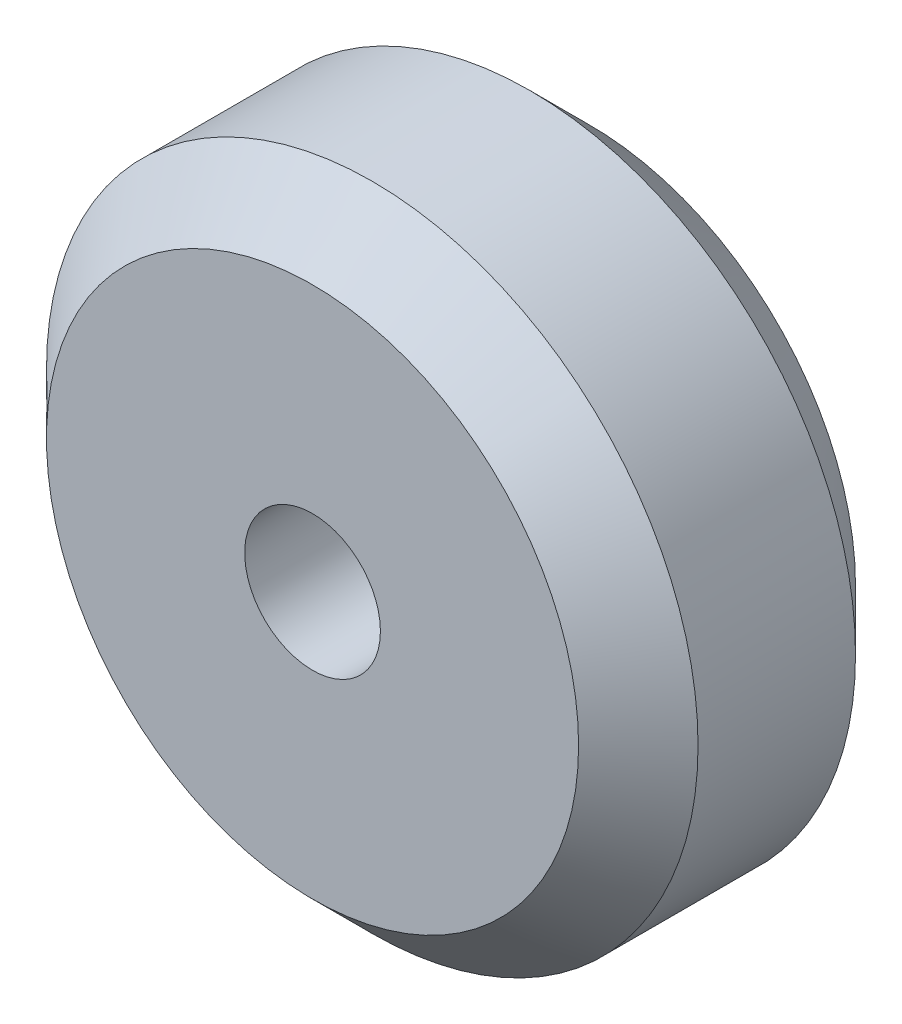
ISO-10303-21;
HEADER;
FILE_DESCRIPTION(('STEP AP214'),'2;1');
FILE_NAME('part.step','',(''),(''),'','','');
FILE_SCHEMA(('AUTOMOTIVE_DESIGN { 1 0 10303 214 1 1 1 1 }'));
ENDSEC;
DATA;
#1=APPLICATION_CONTEXT('core data for automotive mechanical design processes');
#2=APPLICATION_PROTOCOL_DEFINITION('international standard','automotive_design',2000,#1);
#3=PRODUCT_CONTEXT('',#1,'mechanical');
#4=PRODUCT('Part','Part','',(#3));
#5=PRODUCT_RELATED_PRODUCT_CATEGORY('part','',(#4));
#6=PRODUCT_DEFINITION_FORMATION('','',#4);
#7=PRODUCT_DEFINITION_CONTEXT('part definition',#1,'design');
#8=PRODUCT_DEFINITION('design','',#6,#7);
#9=PRODUCT_DEFINITION_SHAPE('','',#8);
#10=(LENGTH_UNIT() NAMED_UNIT(*) SI_UNIT(.MILLI.,.METRE.));
#11=(NAMED_UNIT(*) PLANE_ANGLE_UNIT() SI_UNIT($,.RADIAN.));
#12=(NAMED_UNIT(*) SI_UNIT($,.STERADIAN.) SOLID_ANGLE_UNIT());
#13=UNCERTAINTY_MEASURE_WITH_UNIT(LENGTH_MEASURE(1.E-05),#10,'distance_accuracy_value','');
#14=(GEOMETRIC_REPRESENTATION_CONTEXT(3) GLOBAL_UNCERTAINTY_ASSIGNED_CONTEXT((#13)) GLOBAL_UNIT_ASSIGNED_CONTEXT((#10,
#11,#12)) REPRESENTATION_CONTEXT('',''));
#15=CARTESIAN_POINT('',(0.,0.,0.));
#16=DIRECTION('',(0.,0.,1.));
#17=DIRECTION('',(1.,0.,0.));
#18=AXIS2_PLACEMENT_3D('',#15,#16,#17);
#19=CARTESIAN_POINT('',(19.85,-19.85,10.2));
#20=DIRECTION('',(0.,0.,1.));
#21=DIRECTION('',(1.,0.,0.));
#22=AXIS2_PLACEMENT_3D('',#19,#20,#21);
#23=PLANE('',#22);
#24=CARTESIAN_POINT('',(19.85,-19.85,10.2));
#25=DIRECTION('',(0.,0.,1.));
#26=DIRECTION('',(1.,0.,0.));
#27=AXIS2_PLACEMENT_3D('',#24,#25,#26);
#28=CIRCLE('',#27,9.8);
#29=CARTESIAN_POINT('',(29.65,-19.85,10.2));
#30=VERTEX_POINT('',#29);
#31=EDGE_CURVE('E46',#30,#30,#28,.T.);
#32=ORIENTED_EDGE('',*,*,#31,.T.);
#33=EDGE_LOOP('',(#32));
#34=FACE_BOUND('',#33,.T.);
#35=CARTESIAN_POINT('',(19.85,-19.85,10.2));
#36=DIRECTION('',(0.,0.,1.));
#37=DIRECTION('',(1.,0.,0.));
#38=AXIS2_PLACEMENT_3D('',#35,#36,#37);
#39=CIRCLE('',#38,2.5);
#40=CARTESIAN_POINT('',(22.35,-19.85,10.2));
#41=VERTEX_POINT('',#40);
#42=EDGE_CURVE('E51',#41,#41,#39,.T.);
#43=ORIENTED_EDGE('',*,*,#42,.F.);
#44=EDGE_LOOP('',(#43));
#45=FACE_BOUND('',#44,.T.);
#46=ADVANCED_FACE('F31',(#34,#45),#23,.T.);
#47=CARTESIAN_POINT('',(19.85,-19.85,0.));
#48=DIRECTION('',(0.,0.,1.));
#49=DIRECTION('',(1.,0.,0.));
#50=AXIS2_PLACEMENT_3D('',#47,#48,#49);
#51=PLANE('',#50);
#52=CARTESIAN_POINT('',(19.85,-19.85,0.));
#53=DIRECTION('',(0.,0.,1.));
#54=DIRECTION('',(1.,0.,0.));
#55=AXIS2_PLACEMENT_3D('',#52,#53,#54);
#56=CIRCLE('',#55,9.8);
#57=CARTESIAN_POINT('',(29.65,-19.85,0.));
#58=VERTEX_POINT('',#57);
#59=EDGE_CURVE('E10',#58,#58,#56,.F.);
#60=ORIENTED_EDGE('',*,*,#59,.T.);
#61=EDGE_LOOP('',(#60));
#62=FACE_BOUND('',#61,.T.);
#63=CARTESIAN_POINT('',(19.85,-19.85,0.));
#64=DIRECTION('',(0.,0.,1.));
#65=DIRECTION('',(1.,0.,0.));
#66=AXIS2_PLACEMENT_3D('',#63,#64,#65);
#67=CIRCLE('',#66,2.5);
#68=CARTESIAN_POINT('',(22.35,-19.85,0.));
#69=VERTEX_POINT('',#68);
#70=EDGE_CURVE('E52',#69,#69,#67,.T.);
#71=ORIENTED_EDGE('',*,*,#70,.T.);
#72=EDGE_LOOP('',(#71));
#73=FACE_BOUND('',#72,.T.);
#74=ADVANCED_FACE('F62',(#62,#73),#51,.F.);
#75=CARTESIAN_POINT('',(19.85,-19.85,10.2));
#76=DIRECTION('',(0.,0.,-1.));
#77=DIRECTION('',(-1.,0.,0.));
#78=AXIS2_PLACEMENT_3D('',#75,#76,#77);
#79=CYLINDRICAL_SURFACE('',#78,12.);
#80=CARTESIAN_POINT('',(19.85,-19.85,7.99999999999999));
#81=DIRECTION('',(0.,0.,1.));
#82=DIRECTION('',(1.,0.,0.));
#83=AXIS2_PLACEMENT_3D('',#80,#81,#82);
#84=CIRCLE('',#83,12.);
#85=CARTESIAN_POINT('',(31.85,-19.85,7.99999999999999));
#86=VERTEX_POINT('',#85);
#87=EDGE_CURVE('E38',#86,#86,#84,.F.);
#88=ORIENTED_EDGE('',*,*,#87,.T.);
#89=EDGE_LOOP('',(#88));
#90=FACE_BOUND('',#89,.T.);
#91=CARTESIAN_POINT('',(19.85,-19.85,2.2));
#92=DIRECTION('',(0.,0.,1.));
#93=DIRECTION('',(1.,0.,0.));
#94=AXIS2_PLACEMENT_3D('',#91,#92,#93);
#95=CIRCLE('',#94,12.);
#96=CARTESIAN_POINT('',(31.85,-19.85,2.2));
#97=VERTEX_POINT('',#96);
#98=EDGE_CURVE('E42',#97,#97,#95,.T.);
#99=ORIENTED_EDGE('',*,*,#98,.T.);
#100=EDGE_LOOP('',(#99));
#101=FACE_BOUND('',#100,.T.);
#102=ADVANCED_FACE('F68',(#90,#101),#79,.T.);
#103=CARTESIAN_POINT('',(19.85,-19.85,10.2));
#104=DIRECTION('',(0.,0.,-1.));
#105=DIRECTION('',(-1.,0.,0.));
#106=AXIS2_PLACEMENT_3D('',#103,#104,#105);
#107=CYLINDRICAL_SURFACE('',#106,2.5);
#108=ORIENTED_EDGE('',*,*,#42,.T.);
#109=EDGE_LOOP('',(#108));
#110=FACE_BOUND('',#109,.T.);
#111=ORIENTED_EDGE('',*,*,#70,.F.);
#112=EDGE_LOOP('',(#111));
#113=FACE_BOUND('',#112,.T.);
#114=ADVANCED_FACE('F58',(#110,#113),#107,.F.);
#115=CARTESIAN_POINT('',(19.85,-19.85,10.2));
#116=DIRECTION('',(0.,0.,-1.));
#117=DIRECTION('',(-1.,0.,0.));
#118=AXIS2_PLACEMENT_3D('',#115,#116,#117);
#119=CONICAL_SURFACE('',#118,9.8,0.785398163397447);
#120=ORIENTED_EDGE('',*,*,#87,.F.);
#121=EDGE_LOOP('',(#120));
#122=FACE_BOUND('',#121,.T.);
#123=ORIENTED_EDGE('',*,*,#31,.F.);
#124=EDGE_LOOP('',(#123));
#125=FACE_BOUND('',#124,.T.);
#126=ADVANCED_FACE('F73',(#122,#125),#119,.T.);
#127=CARTESIAN_POINT('',(19.85,-19.85,2.2));
#128=DIRECTION('',(0.,0.,1.));
#129=DIRECTION('',(1.,0.,0.));
#130=AXIS2_PLACEMENT_3D('',#127,#128,#129);
#131=CONICAL_SURFACE('',#130,12.,0.78539816339745);
#132=ORIENTED_EDGE('',*,*,#59,.F.);
#133=EDGE_LOOP('',(#132));
#134=FACE_BOUND('',#133,.T.);
#135=ORIENTED_EDGE('',*,*,#98,.F.);
#136=EDGE_LOOP('',(#135));
#137=FACE_BOUND('',#136,.T.);
#138=ADVANCED_FACE('F33',(#134,#137),#131,.T.);
#139=CLOSED_SHELL('',(#46,#74,#102,#114,#126,#138));
#140=MANIFOLD_SOLID_BREP('B2',#139);
#141=ADVANCED_BREP_SHAPE_REPRESENTATION('',(#18,#140),#14);
#142=SHAPE_DEFINITION_REPRESENTATION(#9,#141);
ENDSEC;
END-ISO-10303-21;
